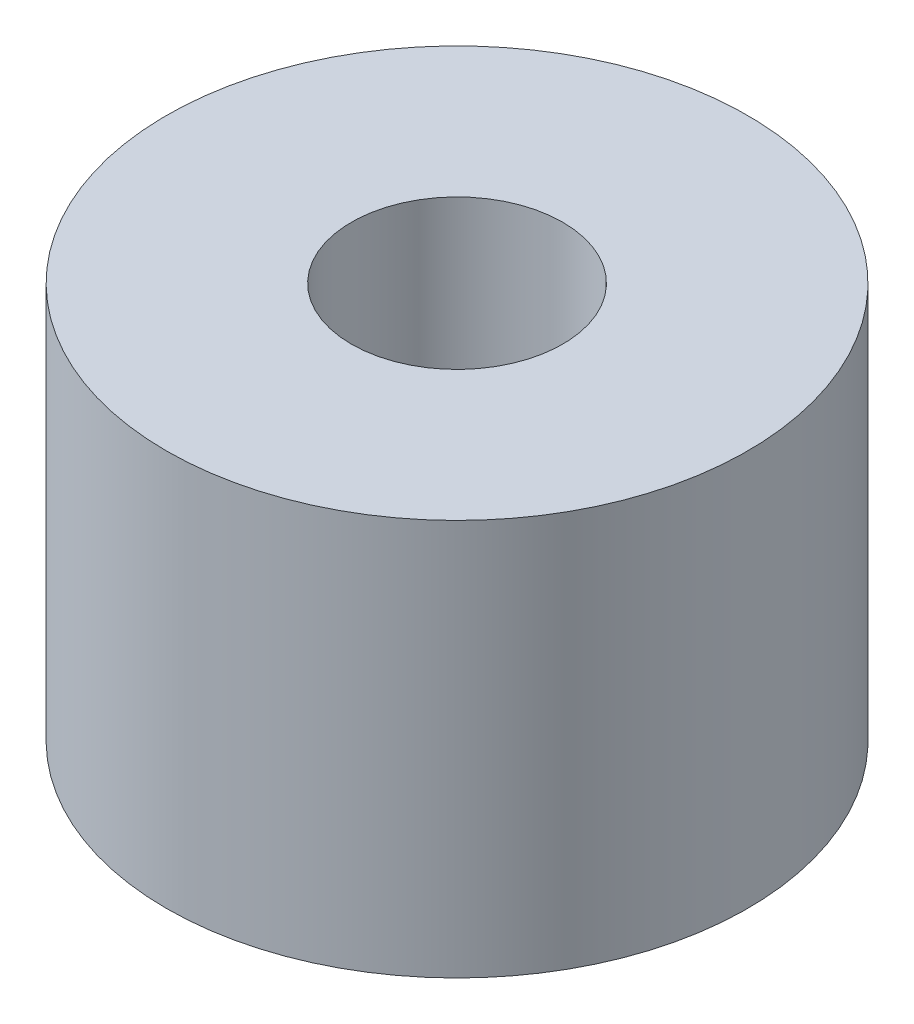
ISO-10303-21;
HEADER;
FILE_DESCRIPTION(('STEP AP214'),'2;1');
FILE_NAME('part.step','',(''),(''),'','','');
FILE_SCHEMA(('AUTOMOTIVE_DESIGN { 1 0 10303 214 1 1 1 1 }'));
ENDSEC;
DATA;
#1=APPLICATION_CONTEXT('core data for automotive mechanical design processes');
#2=APPLICATION_PROTOCOL_DEFINITION('international standard','automotive_design',2000,#1);
#3=PRODUCT_CONTEXT('',#1,'mechanical');
#4=PRODUCT('Part','Part','',(#3));
#5=PRODUCT_RELATED_PRODUCT_CATEGORY('part','',(#4));
#6=PRODUCT_DEFINITION_FORMATION('','',#4);
#7=PRODUCT_DEFINITION_CONTEXT('part definition',#1,'design');
#8=PRODUCT_DEFINITION('design','',#6,#7);
#9=PRODUCT_DEFINITION_SHAPE('','',#8);
#10=(LENGTH_UNIT() NAMED_UNIT(*) SI_UNIT(.MILLI.,.METRE.));
#11=(NAMED_UNIT(*) PLANE_ANGLE_UNIT() SI_UNIT($,.RADIAN.));
#12=(NAMED_UNIT(*) SI_UNIT($,.STERADIAN.) SOLID_ANGLE_UNIT());
#13=UNCERTAINTY_MEASURE_WITH_UNIT(LENGTH_MEASURE(1.E-05),#10,'distance_accuracy_value','');
#14=(GEOMETRIC_REPRESENTATION_CONTEXT(3) GLOBAL_UNCERTAINTY_ASSIGNED_CONTEXT((#13)) GLOBAL_UNIT_ASSIGNED_CONTEXT((#10,
#11,#12)) REPRESENTATION_CONTEXT('',''));
#15=CARTESIAN_POINT('',(0.,0.,0.));
#16=DIRECTION('',(0.,0.,1.));
#17=DIRECTION('',(1.,0.,0.));
#18=AXIS2_PLACEMENT_3D('',#15,#16,#17);
#19=CARTESIAN_POINT('',(0.,15.,0.));
#20=DIRECTION('',(0.,-1.,0.));
#21=DIRECTION('',(0.,0.,-1.));
#22=AXIS2_PLACEMENT_3D('',#19,#20,#21);
#23=CYLINDRICAL_SURFACE('',#22,11.);
#24=CARTESIAN_POINT('',(0.,15.,0.));
#25=DIRECTION('',(0.,1.,0.));
#26=DIRECTION('',(0.,0.,1.));
#27=AXIS2_PLACEMENT_3D('',#24,#25,#26);
#28=CIRCLE('',#27,11.);
#29=CARTESIAN_POINT('',(0.,15.,11.));
#30=VERTEX_POINT('',#29);
#31=EDGE_CURVE('E10',#30,#30,#28,.T.);
#32=ORIENTED_EDGE('',*,*,#31,.F.);
#33=EDGE_LOOP('',(#32));
#34=FACE_BOUND('',#33,.T.);
#35=CARTESIAN_POINT('',(0.,0.,0.));
#36=DIRECTION('',(0.,1.,0.));
#37=DIRECTION('',(0.,0.,1.));
#38=AXIS2_PLACEMENT_3D('',#35,#36,#37);
#39=CIRCLE('',#38,11.);
#40=CARTESIAN_POINT('',(0.,0.,11.));
#41=VERTEX_POINT('',#40);
#42=EDGE_CURVE('E40',#41,#41,#39,.T.);
#43=ORIENTED_EDGE('',*,*,#42,.T.);
#44=EDGE_LOOP('',(#43));
#45=FACE_BOUND('',#44,.T.);
#46=ADVANCED_FACE('F37',(#34,#45),#23,.T.);
#47=CARTESIAN_POINT('',(0.,15.,0.));
#48=DIRECTION('',(0.,1.,0.));
#49=DIRECTION('',(0.,0.,1.));
#50=AXIS2_PLACEMENT_3D('',#47,#48,#49);
#51=PLANE('',#50);
#52=CARTESIAN_POINT('',(0.,15.,0.));
#53=DIRECTION('',(0.,1.,0.));
#54=DIRECTION('',(0.,0.,1.));
#55=AXIS2_PLACEMENT_3D('',#52,#53,#54);
#56=CIRCLE('',#55,4.);
#57=CARTESIAN_POINT('',(0.,15.,4.));
#58=VERTEX_POINT('',#57);
#59=EDGE_CURVE('E51',#58,#58,#56,.T.);
#60=ORIENTED_EDGE('',*,*,#59,.F.);
#61=EDGE_LOOP('',(#60));
#62=FACE_BOUND('',#61,.T.);
#63=ORIENTED_EDGE('',*,*,#31,.T.);
#64=EDGE_LOOP('',(#63));
#65=FACE_BOUND('',#64,.T.);
#66=ADVANCED_FACE('F57',(#62,#65),#51,.T.);
#67=CARTESIAN_POINT('',(0.,0.,0.));
#68=DIRECTION('',(0.,1.,0.));
#69=DIRECTION('',(0.,0.,1.));
#70=AXIS2_PLACEMENT_3D('',#67,#68,#69);
#71=PLANE('',#70);
#72=CARTESIAN_POINT('',(0.,0.,0.));
#73=DIRECTION('',(0.,1.,0.));
#74=DIRECTION('',(0.,0.,1.));
#75=AXIS2_PLACEMENT_3D('',#72,#73,#74);
#76=CIRCLE('',#75,4.);
#77=CARTESIAN_POINT('',(0.,0.,4.));
#78=VERTEX_POINT('',#77);
#79=EDGE_CURVE('E47',#78,#78,#76,.T.);
#80=ORIENTED_EDGE('',*,*,#79,.T.);
#81=EDGE_LOOP('',(#80));
#82=FACE_BOUND('',#81,.T.);
#83=ORIENTED_EDGE('',*,*,#42,.F.);
#84=EDGE_LOOP('',(#83));
#85=FACE_BOUND('',#84,.T.);
#86=ADVANCED_FACE('F59',(#82,#85),#71,.F.);
#87=CARTESIAN_POINT('',(0.,15.,0.));
#88=DIRECTION('',(0.,1.,0.));
#89=DIRECTION('',(0.,0.,1.));
#90=AXIS2_PLACEMENT_3D('',#87,#88,#89);
#91=CYLINDRICAL_SURFACE('',#90,4.);
#92=ORIENTED_EDGE('',*,*,#79,.F.);
#93=EDGE_LOOP('',(#92));
#94=FACE_BOUND('',#93,.T.);
#95=ORIENTED_EDGE('',*,*,#59,.T.);
#96=EDGE_LOOP('',(#95));
#97=FACE_BOUND('',#96,.T.);
#98=ADVANCED_FACE('F55',(#94,#97),#91,.F.);
#99=CLOSED_SHELL('',(#46,#66,#86,#98));
#100=MANIFOLD_SOLID_BREP('B2',#99);
#101=ADVANCED_BREP_SHAPE_REPRESENTATION('',(#18,#100),#14);
#102=SHAPE_DEFINITION_REPRESENTATION(#9,#101);
ENDSEC;
END-ISO-10303-21;
